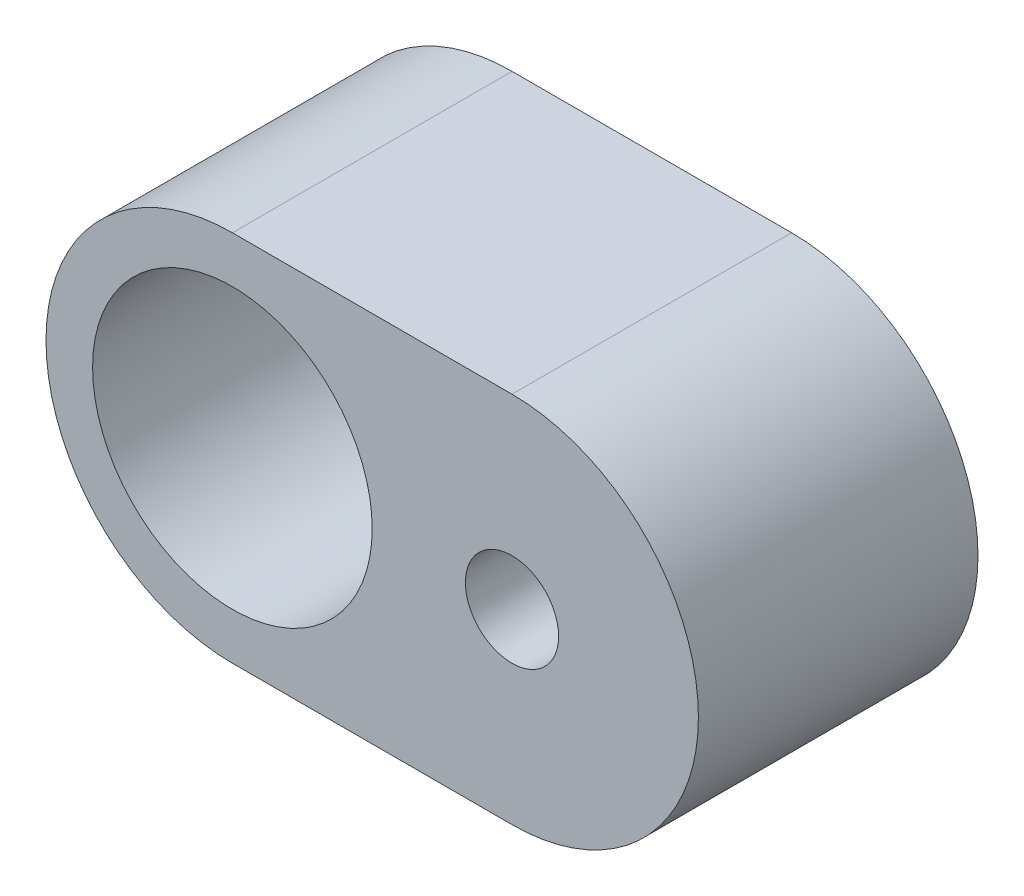
ISO-10303-21;
HEADER;
FILE_DESCRIPTION(('STEP AP214'),'2;1');
FILE_NAME('part.step','',(''),(''),'','','');
FILE_SCHEMA(('AUTOMOTIVE_DESIGN { 1 0 10303 214 1 1 1 1 }'));
ENDSEC;
DATA;
#1=APPLICATION_CONTEXT('core data for automotive mechanical design processes');
#2=APPLICATION_PROTOCOL_DEFINITION('international standard','automotive_design',2000,#1);
#3=PRODUCT_CONTEXT('',#1,'mechanical');
#4=PRODUCT('Part','Part','',(#3));
#5=PRODUCT_RELATED_PRODUCT_CATEGORY('part','',(#4));
#6=PRODUCT_DEFINITION_FORMATION('','',#4);
#7=PRODUCT_DEFINITION_CONTEXT('part definition',#1,'design');
#8=PRODUCT_DEFINITION('design','',#6,#7);
#9=PRODUCT_DEFINITION_SHAPE('','',#8);
#10=(LENGTH_UNIT() NAMED_UNIT(*) SI_UNIT(.MILLI.,.METRE.));
#11=(NAMED_UNIT(*) PLANE_ANGLE_UNIT() SI_UNIT($,.RADIAN.));
#12=(NAMED_UNIT(*) SI_UNIT($,.STERADIAN.) SOLID_ANGLE_UNIT());
#13=UNCERTAINTY_MEASURE_WITH_UNIT(LENGTH_MEASURE(1.E-05),#10,'distance_accuracy_value','');
#14=(GEOMETRIC_REPRESENTATION_CONTEXT(3) GLOBAL_UNCERTAINTY_ASSIGNED_CONTEXT((#13)) GLOBAL_UNIT_ASSIGNED_CONTEXT((#10,
#11,#12)) REPRESENTATION_CONTEXT('',''));
#15=CARTESIAN_POINT('',(0.,0.,0.));
#16=DIRECTION('',(0.,0.,1.));
#17=DIRECTION('',(1.,0.,0.));
#18=AXIS2_PLACEMENT_3D('',#15,#16,#17);
#19=CARTESIAN_POINT('',(-30.,0.,30.));
#20=DIRECTION('',(0.,0.,1.));
#21=DIRECTION('',(1.,0.,0.));
#22=AXIS2_PLACEMENT_3D('',#19,#20,#21);
#23=PLANE('',#22);
#24=CARTESIAN_POINT('',(-30.,0.,30.));
#25=DIRECTION('',(0.,0.,1.));
#26=DIRECTION('',(1.,0.,0.));
#27=AXIS2_PLACEMENT_3D('',#24,#25,#26);
#28=CIRCLE('',#27,15.);
#29=CARTESIAN_POINT('',(-15.,0.,30.));
#30=VERTEX_POINT('',#29);
#31=EDGE_CURVE('E102',#30,#30,#28,.T.);
#32=ORIENTED_EDGE('',*,*,#31,.F.);
#33=EDGE_LOOP('',(#32));
#34=FACE_BOUND('',#33,.T.);
#35=CARTESIAN_POINT('',(-30.,0.,30.));
#36=DIRECTION('',(0.,0.,1.));
#37=DIRECTION('',(1.,0.,0.));
#38=AXIS2_PLACEMENT_3D('',#35,#36,#37);
#39=CIRCLE('',#38,20.);
#40=CARTESIAN_POINT('',(-30.,20.,30.));
#41=VERTEX_POINT('',#40);
#42=CARTESIAN_POINT('',(-30.,-20.,30.));
#43=VERTEX_POINT('',#42);
#44=EDGE_CURVE('E87',#41,#43,#39,.T.);
#45=ORIENTED_EDGE('',*,*,#44,.T.);
#46=DIRECTION('',(1.,0.,0.));
#47=VECTOR('',#46,1.);
#48=CARTESIAN_POINT('',(-30.,-20.,30.));
#49=LINE('',#48,#47);
#50=CARTESIAN_POINT('',(0.,-20.,30.));
#51=VERTEX_POINT('',#50);
#52=EDGE_CURVE('E82',#43,#51,#49,.T.);
#53=ORIENTED_EDGE('',*,*,#52,.T.);
#54=CARTESIAN_POINT('',(0.,0.,30.));
#55=DIRECTION('',(0.,0.,1.));
#56=DIRECTION('',(1.,0.,0.));
#57=AXIS2_PLACEMENT_3D('',#54,#55,#56);
#58=CIRCLE('',#57,20.);
#59=CARTESIAN_POINT('',(0.,20.,30.));
#60=VERTEX_POINT('',#59);
#61=EDGE_CURVE('E85',#51,#60,#58,.T.);
#62=ORIENTED_EDGE('',*,*,#61,.T.);
#63=DIRECTION('',(-1.,0.,0.));
#64=VECTOR('',#63,1.);
#65=CARTESIAN_POINT('',(-30.,20.,30.));
#66=LINE('',#65,#64);
#67=EDGE_CURVE('E52',#60,#41,#66,.T.);
#68=ORIENTED_EDGE('',*,*,#67,.T.);
#69=EDGE_LOOP('',(#45,#53,#62,#68));
#70=FACE_BOUND('',#69,.T.);
#71=CARTESIAN_POINT('',(0.,0.,30.));
#72=DIRECTION('',(0.,0.,1.));
#73=DIRECTION('',(1.,0.,0.));
#74=AXIS2_PLACEMENT_3D('',#71,#72,#73);
#75=CIRCLE('',#74,5.);
#76=CARTESIAN_POINT('',(5.,0.,30.));
#77=VERTEX_POINT('',#76);
#78=EDGE_CURVE('E117',#77,#77,#75,.T.);
#79=ORIENTED_EDGE('',*,*,#78,.F.);
#80=EDGE_LOOP('',(#79));
#81=FACE_BOUND('',#80,.T.);
#82=ADVANCED_FACE('F35',(#34,#70,#81),#23,.T.);
#83=CARTESIAN_POINT('',(-30.,0.,0.));
#84=DIRECTION('',(0.,0.,1.));
#85=DIRECTION('',(1.,0.,0.));
#86=AXIS2_PLACEMENT_3D('',#83,#84,#85);
#87=PLANE('',#86);
#88=CARTESIAN_POINT('',(-30.,0.,0.));
#89=DIRECTION('',(0.,0.,1.));
#90=DIRECTION('',(1.,0.,0.));
#91=AXIS2_PLACEMENT_3D('',#88,#89,#90);
#92=CIRCLE('',#91,15.);
#93=CARTESIAN_POINT('',(-15.,0.,0.));
#94=VERTEX_POINT('',#93);
#95=EDGE_CURVE('E114',#94,#94,#92,.T.);
#96=ORIENTED_EDGE('',*,*,#95,.T.);
#97=EDGE_LOOP('',(#96));
#98=FACE_BOUND('',#97,.T.);
#99=CARTESIAN_POINT('',(-30.,0.,0.));
#100=DIRECTION('',(0.,0.,1.));
#101=DIRECTION('',(1.,0.,0.));
#102=AXIS2_PLACEMENT_3D('',#99,#100,#101);
#103=CIRCLE('',#102,20.);
#104=CARTESIAN_POINT('',(-30.,20.,0.));
#105=VERTEX_POINT('',#104);
#106=CARTESIAN_POINT('',(-30.,-20.,0.));
#107=VERTEX_POINT('',#106);
#108=EDGE_CURVE('E99',#105,#107,#103,.T.);
#109=ORIENTED_EDGE('',*,*,#108,.F.);
#110=DIRECTION('',(-1.,0.,0.));
#111=VECTOR('',#110,1.);
#112=CARTESIAN_POINT('',(-30.,20.,0.));
#113=LINE('',#112,#111);
#114=CARTESIAN_POINT('',(0.,20.,0.));
#115=VERTEX_POINT('',#114);
#116=EDGE_CURVE('E75',#115,#105,#113,.T.);
#117=ORIENTED_EDGE('',*,*,#116,.F.);
#118=CARTESIAN_POINT('',(0.,0.,0.));
#119=DIRECTION('',(0.,0.,1.));
#120=DIRECTION('',(1.,0.,0.));
#121=AXIS2_PLACEMENT_3D('',#118,#119,#120);
#122=CIRCLE('',#121,20.);
#123=CARTESIAN_POINT('',(0.,-20.,0.));
#124=VERTEX_POINT('',#123);
#125=EDGE_CURVE('E69',#124,#115,#122,.T.);
#126=ORIENTED_EDGE('',*,*,#125,.F.);
#127=DIRECTION('',(1.,0.,0.));
#128=VECTOR('',#127,1.);
#129=CARTESIAN_POINT('',(-30.,-20.,0.));
#130=LINE('',#129,#128);
#131=EDGE_CURVE('E91',#107,#124,#130,.T.);
#132=ORIENTED_EDGE('',*,*,#131,.F.);
#133=EDGE_LOOP('',(#109,#117,#126,#132));
#134=FACE_BOUND('',#133,.T.);
#135=CARTESIAN_POINT('',(0.,0.,0.));
#136=DIRECTION('',(0.,0.,1.));
#137=DIRECTION('',(1.,0.,0.));
#138=AXIS2_PLACEMENT_3D('',#135,#136,#137);
#139=CIRCLE('',#138,5.);
#140=CARTESIAN_POINT('',(5.,0.,0.));
#141=VERTEX_POINT('',#140);
#142=EDGE_CURVE('E120',#141,#141,#139,.T.);
#143=ORIENTED_EDGE('',*,*,#142,.T.);
#144=EDGE_LOOP('',(#143));
#145=FACE_BOUND('',#144,.T.);
#146=ADVANCED_FACE('F110',(#98,#134,#145),#87,.F.);
#147=CARTESIAN_POINT('',(-30.,0.,30.));
#148=DIRECTION('',(0.,0.,-1.));
#149=DIRECTION('',(-1.,0.,0.));
#150=AXIS2_PLACEMENT_3D('',#147,#148,#149);
#151=CYLINDRICAL_SURFACE('',#150,20.);
#152=ORIENTED_EDGE('',*,*,#108,.T.);
#153=DIRECTION('',(0.,0.,-1.));
#154=VECTOR('',#153,1.);
#155=CARTESIAN_POINT('',(-30.,-20.,30.));
#156=LINE('',#155,#154);
#157=EDGE_CURVE('E11',#43,#107,#156,.T.);
#158=ORIENTED_EDGE('',*,*,#157,.F.);
#159=ORIENTED_EDGE('',*,*,#44,.F.);
#160=DIRECTION('',(0.,0.,-1.));
#161=VECTOR('',#160,1.);
#162=CARTESIAN_POINT('',(-30.,20.,30.));
#163=LINE('',#162,#161);
#164=EDGE_CURVE('E95',#41,#105,#163,.T.);
#165=ORIENTED_EDGE('',*,*,#164,.T.);
#166=EDGE_LOOP('',(#152,#158,#159,#165));
#167=FACE_BOUND('',#166,.T.);
#168=ADVANCED_FACE('F37',(#167),#151,.T.);
#169=CARTESIAN_POINT('',(-30.,-20.,30.));
#170=DIRECTION('',(0.,1.,0.));
#171=DIRECTION('',(0.,0.,1.));
#172=AXIS2_PLACEMENT_3D('',#169,#170,#171);
#173=PLANE('',#172);
#174=ORIENTED_EDGE('',*,*,#131,.T.);
#175=DIRECTION('',(0.,0.,-1.));
#176=VECTOR('',#175,1.);
#177=CARTESIAN_POINT('',(0.,-20.,30.));
#178=LINE('',#177,#176);
#179=EDGE_CURVE('E44',#51,#124,#178,.T.);
#180=ORIENTED_EDGE('',*,*,#179,.F.);
#181=ORIENTED_EDGE('',*,*,#52,.F.);
#182=ORIENTED_EDGE('',*,*,#157,.T.);
#183=EDGE_LOOP('',(#174,#180,#181,#182));
#184=FACE_BOUND('',#183,.T.);
#185=ADVANCED_FACE('F90',(#184),#173,.F.);
#186=CARTESIAN_POINT('',(0.,0.,30.));
#187=DIRECTION('',(0.,0.,-1.));
#188=DIRECTION('',(-1.,0.,0.));
#189=AXIS2_PLACEMENT_3D('',#186,#187,#188);
#190=CYLINDRICAL_SURFACE('',#189,20.);
#191=ORIENTED_EDGE('',*,*,#125,.T.);
#192=DIRECTION('',(0.,0.,-1.));
#193=VECTOR('',#192,1.);
#194=CARTESIAN_POINT('',(0.,20.,30.));
#195=LINE('',#194,#193);
#196=EDGE_CURVE('E92',#60,#115,#195,.T.);
#197=ORIENTED_EDGE('',*,*,#196,.F.);
#198=ORIENTED_EDGE('',*,*,#61,.F.);
#199=ORIENTED_EDGE('',*,*,#179,.T.);
#200=EDGE_LOOP('',(#191,#197,#198,#199));
#201=FACE_BOUND('',#200,.T.);
#202=ADVANCED_FACE('F93',(#201),#190,.T.);
#203=CARTESIAN_POINT('',(-30.,20.,30.));
#204=DIRECTION('',(0.,-1.,0.));
#205=DIRECTION('',(0.,0.,-1.));
#206=AXIS2_PLACEMENT_3D('',#203,#204,#205);
#207=PLANE('',#206);
#208=ORIENTED_EDGE('',*,*,#116,.T.);
#209=ORIENTED_EDGE('',*,*,#164,.F.);
#210=ORIENTED_EDGE('',*,*,#67,.F.);
#211=ORIENTED_EDGE('',*,*,#196,.T.);
#212=EDGE_LOOP('',(#208,#209,#210,#211));
#213=FACE_BOUND('',#212,.T.);
#214=ADVANCED_FACE('F107',(#213),#207,.F.);
#215=CARTESIAN_POINT('',(-30.,0.,30.));
#216=DIRECTION('',(0.,0.,-1.));
#217=DIRECTION('',(-1.,0.,0.));
#218=AXIS2_PLACEMENT_3D('',#215,#216,#217);
#219=CYLINDRICAL_SURFACE('',#218,15.);
#220=ORIENTED_EDGE('',*,*,#31,.T.);
#221=EDGE_LOOP('',(#220));
#222=FACE_BOUND('',#221,.T.);
#223=ORIENTED_EDGE('',*,*,#95,.F.);
#224=EDGE_LOOP('',(#223));
#225=FACE_BOUND('',#224,.T.);
#226=ADVANCED_FACE('F138',(#222,#225),#219,.F.);
#227=CARTESIAN_POINT('',(0.,0.,30.));
#228=DIRECTION('',(0.,0.,-1.));
#229=DIRECTION('',(-1.,0.,0.));
#230=AXIS2_PLACEMENT_3D('',#227,#228,#229);
#231=CYLINDRICAL_SURFACE('',#230,5.);
#232=ORIENTED_EDGE('',*,*,#78,.T.);
#233=EDGE_LOOP('',(#232));
#234=FACE_BOUND('',#233,.T.);
#235=ORIENTED_EDGE('',*,*,#142,.F.);
#236=EDGE_LOOP('',(#235));
#237=FACE_BOUND('',#236,.T.);
#238=ADVANCED_FACE('F126',(#234,#237),#231,.F.);
#239=CLOSED_SHELL('',(#82,#146,#168,#185,#202,#214,#226,#238));
#240=MANIFOLD_SOLID_BREP('B2',#239);
#241=ADVANCED_BREP_SHAPE_REPRESENTATION('',(#18,#240),#14);
#242=SHAPE_DEFINITION_REPRESENTATION(#9,#241);
ENDSEC;
END-ISO-10303-21;
